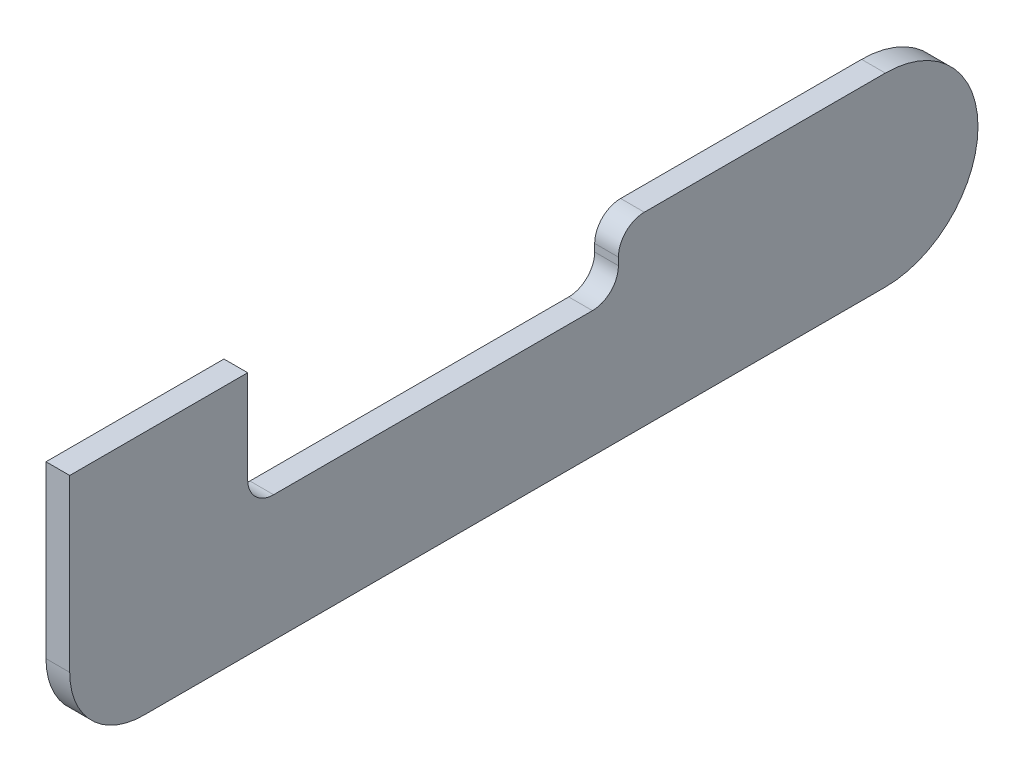
ISO-10303-21;
HEADER;
FILE_DESCRIPTION(('STEP AP214'),'2;1');
FILE_NAME('part.step','',(''),(''),'','','');
FILE_SCHEMA(('AUTOMOTIVE_DESIGN { 1 0 10303 214 1 1 1 1 }'));
ENDSEC;
DATA;
#1=APPLICATION_CONTEXT('core data for automotive mechanical design processes');
#2=APPLICATION_PROTOCOL_DEFINITION('international standard','automotive_design',2000,#1);
#3=PRODUCT_CONTEXT('',#1,'mechanical');
#4=PRODUCT('Part','Part','',(#3));
#5=PRODUCT_RELATED_PRODUCT_CATEGORY('part','',(#4));
#6=PRODUCT_DEFINITION_FORMATION('','',#4);
#7=PRODUCT_DEFINITION_CONTEXT('part definition',#1,'design');
#8=PRODUCT_DEFINITION('design','',#6,#7);
#9=PRODUCT_DEFINITION_SHAPE('','',#8);
#10=(LENGTH_UNIT() NAMED_UNIT(*) SI_UNIT(.MILLI.,.METRE.));
#11=(NAMED_UNIT(*) PLANE_ANGLE_UNIT() SI_UNIT($,.RADIAN.));
#12=(NAMED_UNIT(*) SI_UNIT($,.STERADIAN.) SOLID_ANGLE_UNIT());
#13=UNCERTAINTY_MEASURE_WITH_UNIT(LENGTH_MEASURE(1.E-05),#10,'distance_accuracy_value','');
#14=(GEOMETRIC_REPRESENTATION_CONTEXT(3) GLOBAL_UNCERTAINTY_ASSIGNED_CONTEXT((#13)) GLOBAL_UNIT_ASSIGNED_CONTEXT((#10,
#11,#12)) REPRESENTATION_CONTEXT('',''));
#15=CARTESIAN_POINT('',(0.,0.,0.));
#16=DIRECTION('',(0.,0.,1.));
#17=DIRECTION('',(1.,0.,0.));
#18=AXIS2_PLACEMENT_3D('',#15,#16,#17);
#19=CARTESIAN_POINT('',(1.6,-2.24999999999999,-75.25));
#20=DIRECTION('',(-1.,0.,0.));
#21=DIRECTION('',(0.,0.,1.));
#22=AXIS2_PLACEMENT_3D('',#19,#20,#21);
#23=CYLINDRICAL_SURFACE('',#22,1.75);
#24=CARTESIAN_POINT('',(0.,-2.24999999999999,-75.25));
#25=DIRECTION('',(1.,0.,0.));
#26=DIRECTION('',(0.,0.,-1.));
#27=AXIS2_PLACEMENT_3D('',#24,#25,#26);
#28=CIRCLE('',#27,1.75);
#29=CARTESIAN_POINT('',(0.,-3.99999999999999,-75.25));
#30=VERTEX_POINT('',#29);
#31=CARTESIAN_POINT('',(0.,-2.24999999999998,-77.));
#32=VERTEX_POINT('',#31);
#33=EDGE_CURVE('E191',#30,#32,#28,.T.);
#34=ORIENTED_EDGE('',*,*,#33,.F.);
#35=DIRECTION('',(-1.,0.,0.));
#36=VECTOR('',#35,1.);
#37=CARTESIAN_POINT('',(1.6,-3.99999999999999,-75.25));
#38=LINE('',#37,#36);
#39=CARTESIAN_POINT('',(1.6,-3.99999999999999,-75.25));
#40=VERTEX_POINT('',#39);
#41=EDGE_CURVE('E11',#40,#30,#38,.T.);
#42=ORIENTED_EDGE('',*,*,#41,.F.);
#43=CARTESIAN_POINT('',(1.6,-2.24999999999999,-75.25));
#44=DIRECTION('',(1.,0.,0.));
#45=DIRECTION('',(0.,0.,-1.));
#46=AXIS2_PLACEMENT_3D('',#43,#44,#45);
#47=CIRCLE('',#46,1.75);
#48=CARTESIAN_POINT('',(1.6,-2.24999999999998,-77.));
#49=VERTEX_POINT('',#48);
#50=EDGE_CURVE('E232',#40,#49,#47,.T.);
#51=ORIENTED_EDGE('',*,*,#50,.T.);
#52=DIRECTION('',(-1.,0.,0.));
#53=VECTOR('',#52,1.);
#54=CARTESIAN_POINT('',(1.6,-2.24999999999998,-77.));
#55=LINE('',#54,#53);
#56=EDGE_CURVE('E124',#49,#32,#55,.T.);
#57=ORIENTED_EDGE('',*,*,#56,.T.);
#58=EDGE_LOOP('',(#34,#42,#51,#57));
#59=FACE_BOUND('',#58,.T.);
#60=ADVANCED_FACE('F44',(#59),#23,.F.);
#61=CARTESIAN_POINT('',(1.6,-3.99999999999999,0.));
#62=DIRECTION('',(0.,1.,0.));
#63=DIRECTION('',(0.,0.,1.));
#64=AXIS2_PLACEMENT_3D('',#61,#62,#63);
#65=PLANE('',#64);
#66=DIRECTION('',(0.,0.,-1.));
#67=VECTOR('',#66,1.);
#68=CARTESIAN_POINT('',(0.,-3.99999999999999,0.));
#69=LINE('',#68,#67);
#70=CARTESIAN_POINT('',(0.,-3.99999999999999,-53.75));
#71=VERTEX_POINT('',#70);
#72=EDGE_CURVE('E195',#71,#30,#69,.T.);
#73=ORIENTED_EDGE('',*,*,#72,.F.);
#74=DIRECTION('',(-1.,0.,0.));
#75=VECTOR('',#74,1.);
#76=CARTESIAN_POINT('',(1.6,-3.99999999999999,-53.75));
#77=LINE('',#76,#75);
#78=CARTESIAN_POINT('',(1.6,-3.99999999999999,-53.75));
#79=VERTEX_POINT('',#78);
#80=EDGE_CURVE('E53',#79,#71,#77,.T.);
#81=ORIENTED_EDGE('',*,*,#80,.F.);
#82=DIRECTION('',(0.,0.,-1.));
#83=VECTOR('',#82,1.);
#84=CARTESIAN_POINT('',(1.6,-3.99999999999999,0.));
#85=LINE('',#84,#83);
#86=EDGE_CURVE('E281',#79,#40,#85,.T.);
#87=ORIENTED_EDGE('',*,*,#86,.T.);
#88=ORIENTED_EDGE('',*,*,#41,.T.);
#89=EDGE_LOOP('',(#73,#81,#87,#88));
#90=FACE_BOUND('',#89,.T.);
#91=ADVANCED_FACE('F268',(#90),#65,.T.);
#92=CARTESIAN_POINT('',(1.6,-2.24999999999999,-53.75));
#93=DIRECTION('',(-1.,0.,0.));
#94=DIRECTION('',(0.,0.,1.));
#95=AXIS2_PLACEMENT_3D('',#92,#93,#94);
#96=CYLINDRICAL_SURFACE('',#95,1.75);
#97=CARTESIAN_POINT('',(0.,-2.24999999999999,-53.75));
#98=DIRECTION('',(1.,0.,0.));
#99=DIRECTION('',(0.,0.,-1.));
#100=AXIS2_PLACEMENT_3D('',#97,#98,#99);
#101=CIRCLE('',#100,1.75);
#102=CARTESIAN_POINT('',(0.,-2.24999999999998,-52.));
#103=VERTEX_POINT('',#102);
#104=EDGE_CURVE('E199',#103,#71,#101,.T.);
#105=ORIENTED_EDGE('',*,*,#104,.F.);
#106=DIRECTION('',(-1.,0.,0.));
#107=VECTOR('',#106,1.);
#108=CARTESIAN_POINT('',(1.6,-2.24999999999998,-52.));
#109=LINE('',#108,#107);
#110=CARTESIAN_POINT('',(1.6,-2.24999999999998,-52.));
#111=VERTEX_POINT('',#110);
#112=EDGE_CURVE('E254',#111,#103,#109,.T.);
#113=ORIENTED_EDGE('',*,*,#112,.F.);
#114=CARTESIAN_POINT('',(1.6,-2.24999999999999,-53.75));
#115=DIRECTION('',(1.,0.,0.));
#116=DIRECTION('',(0.,0.,-1.));
#117=AXIS2_PLACEMENT_3D('',#114,#115,#116);
#118=CIRCLE('',#117,1.75);
#119=EDGE_CURVE('E264',#111,#79,#118,.T.);
#120=ORIENTED_EDGE('',*,*,#119,.T.);
#121=ORIENTED_EDGE('',*,*,#80,.T.);
#122=EDGE_LOOP('',(#105,#113,#120,#121));
#123=FACE_BOUND('',#122,.T.);
#124=ADVANCED_FACE('F262',(#123),#96,.F.);
#125=CARTESIAN_POINT('',(1.6,0.,-52.));
#126=DIRECTION('',(0.,0.,-1.));
#127=DIRECTION('',(-1.,0.,0.));
#128=AXIS2_PLACEMENT_3D('',#125,#126,#127);
#129=PLANE('',#128);
#130=DIRECTION('',(0.,-1.,0.));
#131=VECTOR('',#130,1.);
#132=CARTESIAN_POINT('',(0.,0.,-52.));
#133=LINE('',#132,#131);
#134=CARTESIAN_POINT('',(0.,4.00000000000001,-52.));
#135=VERTEX_POINT('',#134);
#136=EDGE_CURVE('E203',#135,#103,#133,.T.);
#137=ORIENTED_EDGE('',*,*,#136,.F.);
#138=DIRECTION('',(-1.,0.,0.));
#139=VECTOR('',#138,1.);
#140=CARTESIAN_POINT('',(1.6,4.00000000000001,-52.));
#141=LINE('',#140,#139);
#142=CARTESIAN_POINT('',(1.6,4.00000000000001,-52.));
#143=VERTEX_POINT('',#142);
#144=EDGE_CURVE('E251',#143,#135,#141,.T.);
#145=ORIENTED_EDGE('',*,*,#144,.F.);
#146=DIRECTION('',(0.,-1.,0.));
#147=VECTOR('',#146,1.);
#148=CARTESIAN_POINT('',(1.6,0.,-52.));
#149=LINE('',#148,#147);
#150=EDGE_CURVE('E278',#143,#111,#149,.T.);
#151=ORIENTED_EDGE('',*,*,#150,.T.);
#152=ORIENTED_EDGE('',*,*,#112,.T.);
#153=EDGE_LOOP('',(#137,#145,#151,#152));
#154=FACE_BOUND('',#153,.T.);
#155=ADVANCED_FACE('F275',(#154),#129,.T.);
#156=CARTESIAN_POINT('',(1.6,4.00000000000001,0.));
#157=DIRECTION('',(0.,1.,0.));
#158=DIRECTION('',(0.,0.,1.));
#159=AXIS2_PLACEMENT_3D('',#156,#157,#158);
#160=PLANE('',#159);
#161=DIRECTION('',(0.,0.,-1.));
#162=VECTOR('',#161,1.);
#163=CARTESIAN_POINT('',(0.,4.00000000000001,0.));
#164=LINE('',#163,#162);
#165=CARTESIAN_POINT('',(0.,4.00000000000001,-40.));
#166=VERTEX_POINT('',#165);
#167=EDGE_CURVE('E207',#166,#135,#164,.T.);
#168=ORIENTED_EDGE('',*,*,#167,.F.);
#169=DIRECTION('',(-1.,0.,0.));
#170=VECTOR('',#169,1.);
#171=CARTESIAN_POINT('',(1.6,4.00000000000001,-40.));
#172=LINE('',#171,#170);
#173=CARTESIAN_POINT('',(1.6,4.00000000000001,-40.));
#174=VERTEX_POINT('',#173);
#175=EDGE_CURVE('E248',#174,#166,#172,.T.);
#176=ORIENTED_EDGE('',*,*,#175,.F.);
#177=DIRECTION('',(0.,0.,-1.));
#178=VECTOR('',#177,1.);
#179=CARTESIAN_POINT('',(1.6,4.00000000000001,0.));
#180=LINE('',#179,#178);
#181=EDGE_CURVE('E284',#174,#143,#180,.T.);
#182=ORIENTED_EDGE('',*,*,#181,.T.);
#183=ORIENTED_EDGE('',*,*,#144,.T.);
#184=EDGE_LOOP('',(#168,#176,#182,#183));
#185=FACE_BOUND('',#184,.T.);
#186=ADVANCED_FACE('F398',(#185),#160,.T.);
#187=CARTESIAN_POINT('',(1.6,0.,-40.));
#188=DIRECTION('',(0.,0.,-1.));
#189=DIRECTION('',(-1.,0.,0.));
#190=AXIS2_PLACEMENT_3D('',#187,#188,#189);
#191=PLANE('',#190);
#192=DIRECTION('',(0.,-1.,0.));
#193=VECTOR('',#192,1.);
#194=CARTESIAN_POINT('',(0.,0.,-40.));
#195=LINE('',#194,#193);
#196=CARTESIAN_POINT('',(0.,-7.50000000000039,-40.));
#197=VERTEX_POINT('',#196);
#198=EDGE_CURVE('E211',#166,#197,#195,.T.);
#199=ORIENTED_EDGE('',*,*,#198,.T.);
#200=DIRECTION('',(-1.,0.,0.));
#201=VECTOR('',#200,1.);
#202=CARTESIAN_POINT('',(1.6,-7.50000000000039,-40.));
#203=LINE('',#202,#201);
#204=CARTESIAN_POINT('',(1.6,-7.50000000000039,-40.));
#205=VERTEX_POINT('',#204);
#206=EDGE_CURVE('E245',#205,#197,#203,.T.);
#207=ORIENTED_EDGE('',*,*,#206,.F.);
#208=DIRECTION('',(0.,-1.,0.));
#209=VECTOR('',#208,1.);
#210=CARTESIAN_POINT('',(1.6,0.,-40.));
#211=LINE('',#210,#209);
#212=EDGE_CURVE('E292',#174,#205,#211,.T.);
#213=ORIENTED_EDGE('',*,*,#212,.F.);
#214=ORIENTED_EDGE('',*,*,#175,.T.);
#215=EDGE_LOOP('',(#199,#207,#213,#214));
#216=FACE_BOUND('',#215,.T.);
#217=ADVANCED_FACE('F389',(#216),#191,.F.);
#218=CARTESIAN_POINT('',(1.6,-7.50000000000043,-45.));
#219=DIRECTION('',(-1.,0.,0.));
#220=DIRECTION('',(0.,0.,1.));
#221=AXIS2_PLACEMENT_3D('',#218,#219,#220);
#222=CYLINDRICAL_SURFACE('',#221,5.);
#223=CARTESIAN_POINT('',(0.,-7.50000000000043,-45.));
#224=DIRECTION('',(1.,0.,0.));
#225=DIRECTION('',(0.,0.,-1.));
#226=AXIS2_PLACEMENT_3D('',#223,#224,#225);
#227=CIRCLE('',#226,5.);
#228=CARTESIAN_POINT('',(0.,-12.5000000000004,-45.));
#229=VERTEX_POINT('',#228);
#230=EDGE_CURVE('E215',#229,#197,#227,.F.);
#231=ORIENTED_EDGE('',*,*,#230,.F.);
#232=DIRECTION('',(-1.,0.,0.));
#233=VECTOR('',#232,1.);
#234=CARTESIAN_POINT('',(1.6,-12.5000000000004,-45.));
#235=LINE('',#234,#233);
#236=CARTESIAN_POINT('',(1.6,-12.5000000000004,-45.));
#237=VERTEX_POINT('',#236);
#238=EDGE_CURVE('E242',#237,#229,#235,.T.);
#239=ORIENTED_EDGE('',*,*,#238,.F.);
#240=CARTESIAN_POINT('',(1.6,-7.50000000000043,-45.));
#241=DIRECTION('',(1.,0.,0.));
#242=DIRECTION('',(0.,0.,-1.));
#243=AXIS2_PLACEMENT_3D('',#240,#241,#242);
#244=CIRCLE('',#243,5.);
#245=EDGE_CURVE('E295',#237,#205,#244,.F.);
#246=ORIENTED_EDGE('',*,*,#245,.T.);
#247=ORIENTED_EDGE('',*,*,#206,.T.);
#248=EDGE_LOOP('',(#231,#239,#246,#247));
#249=FACE_BOUND('',#248,.T.);
#250=ADVANCED_FACE('F311',(#249),#222,.T.);
#251=CARTESIAN_POINT('',(1.6,-12.5000000000004,0.));
#252=DIRECTION('',(0.,-1.,0.));
#253=DIRECTION('',(0.,0.,-1.));
#254=AXIS2_PLACEMENT_3D('',#251,#252,#253);
#255=PLANE('',#254);
#256=DIRECTION('',(0.,0.,1.));
#257=VECTOR('',#256,1.);
#258=CARTESIAN_POINT('',(0.,-12.5000000000004,0.));
#259=LINE('',#258,#257);
#260=CARTESIAN_POINT('',(0.,-12.5000000000004,-95.0000000000006));
#261=VERTEX_POINT('',#260);
#262=EDGE_CURVE('E219',#261,#229,#259,.T.);
#263=ORIENTED_EDGE('',*,*,#262,.F.);
#264=DIRECTION('',(-1.,0.,0.));
#265=VECTOR('',#264,1.);
#266=CARTESIAN_POINT('',(1.6,-12.5000000000004,-95.0000000000006));
#267=LINE('',#266,#265);
#268=CARTESIAN_POINT('',(1.6,-12.5000000000004,-95.0000000000006));
#269=VERTEX_POINT('',#268);
#270=EDGE_CURVE('E239',#269,#261,#267,.T.);
#271=ORIENTED_EDGE('',*,*,#270,.F.);
#272=DIRECTION('',(0.,0.,1.));
#273=VECTOR('',#272,1.);
#274=CARTESIAN_POINT('',(1.6,-12.5000000000004,0.));
#275=LINE('',#274,#273);
#276=EDGE_CURVE('E299',#269,#237,#275,.T.);
#277=ORIENTED_EDGE('',*,*,#276,.T.);
#278=ORIENTED_EDGE('',*,*,#238,.T.);
#279=EDGE_LOOP('',(#263,#271,#277,#278));
#280=FACE_BOUND('',#279,.T.);
#281=ADVANCED_FACE('F305',(#280),#255,.T.);
#282=CARTESIAN_POINT('',(1.6,-6.25000000000043,-95.0000000000006));
#283=DIRECTION('',(-1.,0.,0.));
#284=DIRECTION('',(0.,0.,1.));
#285=AXIS2_PLACEMENT_3D('',#282,#283,#284);
#286=CYLINDRICAL_SURFACE('',#285,6.25);
#287=CARTESIAN_POINT('',(0.,-6.25000000000043,-95.0000000000006));
#288=DIRECTION('',(1.,0.,0.));
#289=DIRECTION('',(0.,0.,-1.));
#290=AXIS2_PLACEMENT_3D('',#287,#288,#289);
#291=CIRCLE('',#290,6.25);
#292=CARTESIAN_POINT('',(0.,-2.22959053969769E-12,-95.0000000000006));
#293=VERTEX_POINT('',#292);
#294=EDGE_CURVE('E223',#261,#293,#291,.T.);
#295=ORIENTED_EDGE('',*,*,#294,.T.);
#296=DIRECTION('',(-1.,0.,0.));
#297=VECTOR('',#296,1.);
#298=CARTESIAN_POINT('',(1.6,-2.22959053969769E-12,-95.0000000000006));
#299=LINE('',#298,#297);
#300=CARTESIAN_POINT('',(1.6,-2.22959053969769E-12,-95.0000000000006));
#301=VERTEX_POINT('',#300);
#302=EDGE_CURVE('E180',#301,#293,#299,.T.);
#303=ORIENTED_EDGE('',*,*,#302,.F.);
#304=CARTESIAN_POINT('',(1.6,-6.25000000000043,-95.0000000000006));
#305=DIRECTION('',(1.,0.,0.));
#306=DIRECTION('',(0.,0.,-1.));
#307=AXIS2_PLACEMENT_3D('',#304,#305,#306);
#308=CIRCLE('',#307,6.25);
#309=EDGE_CURVE('E169',#269,#301,#308,.T.);
#310=ORIENTED_EDGE('',*,*,#309,.F.);
#311=ORIENTED_EDGE('',*,*,#270,.T.);
#312=EDGE_LOOP('',(#295,#303,#310,#311));
#313=FACE_BOUND('',#312,.T.);
#314=ADVANCED_FACE('F314',(#313),#286,.T.);
#315=CARTESIAN_POINT('',(1.6,0.,0.));
#316=DIRECTION('',(0.,-1.,0.));
#317=DIRECTION('',(0.,0.,-1.));
#318=AXIS2_PLACEMENT_3D('',#315,#316,#317);
#319=PLANE('',#318);
#320=DIRECTION('',(0.,0.,1.));
#321=VECTOR('',#320,1.);
#322=CARTESIAN_POINT('',(0.,0.,0.));
#323=LINE('',#322,#321);
#324=CARTESIAN_POINT('',(0.,-1.84821321053887E-12,-78.7500000000001));
#325=VERTEX_POINT('',#324);
#326=EDGE_CURVE('E178',#293,#325,#323,.T.);
#327=ORIENTED_EDGE('',*,*,#326,.T.);
#328=DIRECTION('',(-1.,0.,0.));
#329=VECTOR('',#328,1.);
#330=CARTESIAN_POINT('',(1.6,-1.84821321053887E-12,-78.7500000000001));
#331=LINE('',#330,#329);
#332=CARTESIAN_POINT('',(1.6,-1.84821321053887E-12,-78.7500000000001));
#333=VERTEX_POINT('',#332);
#334=EDGE_CURVE('E175',#333,#325,#331,.T.);
#335=ORIENTED_EDGE('',*,*,#334,.F.);
#336=DIRECTION('',(0.,0.,1.));
#337=VECTOR('',#336,1.);
#338=CARTESIAN_POINT('',(1.6,0.,0.));
#339=LINE('',#338,#337);
#340=EDGE_CURVE('E162',#301,#333,#339,.T.);
#341=ORIENTED_EDGE('',*,*,#340,.F.);
#342=ORIENTED_EDGE('',*,*,#302,.T.);
#343=EDGE_LOOP('',(#327,#335,#341,#342));
#344=FACE_BOUND('',#343,.T.);
#345=ADVANCED_FACE('F176',(#344),#319,.F.);
#346=CARTESIAN_POINT('',(1.6,-1.75000000000004,-78.75));
#347=DIRECTION('',(-1.,0.,0.));
#348=DIRECTION('',(0.,0.,1.));
#349=AXIS2_PLACEMENT_3D('',#346,#347,#348);
#350=CYLINDRICAL_SURFACE('',#349,1.75);
#351=CARTESIAN_POINT('',(0.,-1.75000000000004,-78.75));
#352=DIRECTION('',(1.,0.,0.));
#353=DIRECTION('',(0.,0.,-1.));
#354=AXIS2_PLACEMENT_3D('',#351,#352,#353);
#355=CIRCLE('',#354,1.75);
#356=CARTESIAN_POINT('',(0.,-1.75000000000005,-77.));
#357=VERTEX_POINT('',#356);
#358=EDGE_CURVE('E117',#325,#357,#355,.T.);
#359=ORIENTED_EDGE('',*,*,#358,.T.);
#360=DIRECTION('',(-1.,0.,0.));
#361=VECTOR('',#360,1.);
#362=CARTESIAN_POINT('',(1.6,-1.75000000000005,-77.));
#363=LINE('',#362,#361);
#364=CARTESIAN_POINT('',(1.6,-1.75000000000005,-77.));
#365=VERTEX_POINT('',#364);
#366=EDGE_CURVE('E181',#365,#357,#363,.T.);
#367=ORIENTED_EDGE('',*,*,#366,.F.);
#368=CARTESIAN_POINT('',(1.6,-1.75000000000004,-78.75));
#369=DIRECTION('',(1.,0.,0.));
#370=DIRECTION('',(0.,0.,-1.));
#371=AXIS2_PLACEMENT_3D('',#368,#369,#370);
#372=CIRCLE('',#371,1.75);
#373=EDGE_CURVE('E166',#333,#365,#372,.T.);
#374=ORIENTED_EDGE('',*,*,#373,.F.);
#375=ORIENTED_EDGE('',*,*,#334,.T.);
#376=EDGE_LOOP('',(#359,#367,#374,#375));
#377=FACE_BOUND('',#376,.T.);
#378=ADVANCED_FACE('F183',(#377),#350,.T.);
#379=CARTESIAN_POINT('',(1.6,0.,-77.));
#380=DIRECTION('',(0.,0.,-1.));
#381=DIRECTION('',(-1.,0.,0.));
#382=AXIS2_PLACEMENT_3D('',#379,#380,#381);
#383=PLANE('',#382);
#384=DIRECTION('',(0.,-1.,0.));
#385=VECTOR('',#384,1.);
#386=CARTESIAN_POINT('',(0.,0.,-77.));
#387=LINE('',#386,#385);
#388=EDGE_CURVE('E229',#357,#32,#387,.T.);
#389=ORIENTED_EDGE('',*,*,#388,.T.);
#390=ORIENTED_EDGE('',*,*,#56,.F.);
#391=DIRECTION('',(0.,-1.,0.));
#392=VECTOR('',#391,1.);
#393=CARTESIAN_POINT('',(1.6,0.,-77.));
#394=LINE('',#393,#392);
#395=EDGE_CURVE('E64',#365,#49,#394,.T.);
#396=ORIENTED_EDGE('',*,*,#395,.F.);
#397=ORIENTED_EDGE('',*,*,#366,.T.);
#398=EDGE_LOOP('',(#389,#390,#396,#397));
#399=FACE_BOUND('',#398,.T.);
#400=ADVANCED_FACE('F331',(#399),#383,.F.);
#401=CARTESIAN_POINT('',(1.6,0.,0.));
#402=DIRECTION('',(1.,0.,0.));
#403=DIRECTION('',(0.,0.,-1.));
#404=AXIS2_PLACEMENT_3D('',#401,#402,#403);
#405=PLANE('',#404);
#406=ORIENTED_EDGE('',*,*,#50,.F.);
#407=ORIENTED_EDGE('',*,*,#86,.F.);
#408=ORIENTED_EDGE('',*,*,#119,.F.);
#409=ORIENTED_EDGE('',*,*,#150,.F.);
#410=ORIENTED_EDGE('',*,*,#181,.F.);
#411=ORIENTED_EDGE('',*,*,#212,.T.);
#412=ORIENTED_EDGE('',*,*,#245,.F.);
#413=ORIENTED_EDGE('',*,*,#276,.F.);
#414=ORIENTED_EDGE('',*,*,#309,.T.);
#415=ORIENTED_EDGE('',*,*,#340,.T.);
#416=ORIENTED_EDGE('',*,*,#373,.T.);
#417=ORIENTED_EDGE('',*,*,#395,.T.);
#418=EDGE_LOOP('',(#406,#407,#408,#409,#410,#411,#412,#413,#414,#415,#416,#417));
#419=FACE_BOUND('',#418,.T.);
#420=ADVANCED_FACE('F164',(#419),#405,.T.);
#421=CARTESIAN_POINT('',(0.,0.,0.));
#422=DIRECTION('',(1.,0.,0.));
#423=DIRECTION('',(0.,0.,-1.));
#424=AXIS2_PLACEMENT_3D('',#421,#422,#423);
#425=PLANE('',#424);
#426=ORIENTED_EDGE('',*,*,#33,.T.);
#427=ORIENTED_EDGE('',*,*,#388,.F.);
#428=ORIENTED_EDGE('',*,*,#358,.F.);
#429=ORIENTED_EDGE('',*,*,#326,.F.);
#430=ORIENTED_EDGE('',*,*,#294,.F.);
#431=ORIENTED_EDGE('',*,*,#262,.T.);
#432=ORIENTED_EDGE('',*,*,#230,.T.);
#433=ORIENTED_EDGE('',*,*,#198,.F.);
#434=ORIENTED_EDGE('',*,*,#167,.T.);
#435=ORIENTED_EDGE('',*,*,#136,.T.);
#436=ORIENTED_EDGE('',*,*,#104,.T.);
#437=ORIENTED_EDGE('',*,*,#72,.T.);
#438=EDGE_LOOP('',(#426,#427,#428,#429,#430,#431,#432,#433,#434,#435,#436,#437));
#439=FACE_BOUND('',#438,.T.);
#440=ADVANCED_FACE('F270',(#439),#425,.F.);
#441=CLOSED_SHELL('',(#60,#91,#124,#155,#186,#217,#250,#281,#314,#345,#378,#400,#420,#440));
#442=MANIFOLD_SOLID_BREP('B2',#441);
#443=ADVANCED_BREP_SHAPE_REPRESENTATION('',(#18,#442),#14);
#444=SHAPE_DEFINITION_REPRESENTATION(#9,#443);
ENDSEC;
END-ISO-10303-21;
